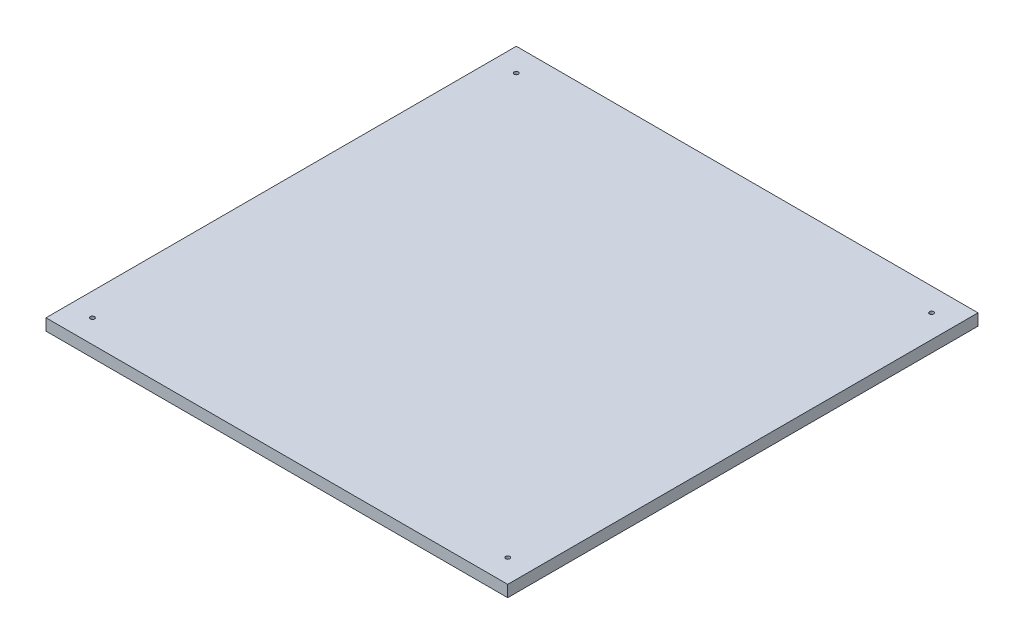
ISO-10303-21;
HEADER;
FILE_DESCRIPTION(('STEP AP214'),'2;1');
FILE_NAME('part.step','',(''),(''),'','','');
FILE_SCHEMA(('AUTOMOTIVE_DESIGN { 1 0 10303 214 1 1 1 1 }'));
ENDSEC;
DATA;
#1=APPLICATION_CONTEXT('core data for automotive mechanical design processes');
#2=APPLICATION_PROTOCOL_DEFINITION('international standard','automotive_design',2000,#1);
#3=PRODUCT_CONTEXT('',#1,'mechanical');
#4=PRODUCT('Part','Part','',(#3));
#5=PRODUCT_RELATED_PRODUCT_CATEGORY('part','',(#4));
#6=PRODUCT_DEFINITION_FORMATION('','',#4);
#7=PRODUCT_DEFINITION_CONTEXT('part definition',#1,'design');
#8=PRODUCT_DEFINITION('design','',#6,#7);
#9=PRODUCT_DEFINITION_SHAPE('','',#8);
#10=(LENGTH_UNIT() NAMED_UNIT(*) SI_UNIT(.MILLI.,.METRE.));
#11=(NAMED_UNIT(*) PLANE_ANGLE_UNIT() SI_UNIT($,.RADIAN.));
#12=(NAMED_UNIT(*) SI_UNIT($,.STERADIAN.) SOLID_ANGLE_UNIT());
#13=UNCERTAINTY_MEASURE_WITH_UNIT(LENGTH_MEASURE(1.E-05),#10,'distance_accuracy_value','');
#14=(GEOMETRIC_REPRESENTATION_CONTEXT(3) GLOBAL_UNCERTAINTY_ASSIGNED_CONTEXT((#13)) GLOBAL_UNIT_ASSIGNED_CONTEXT((#10,
#11,#12)) REPRESENTATION_CONTEXT('',''));
#15=CARTESIAN_POINT('',(0.,0.,0.));
#16=DIRECTION('',(0.,0.,1.));
#17=DIRECTION('',(1.,0.,0.));
#18=AXIS2_PLACEMENT_3D('',#15,#16,#17);
#19=CARTESIAN_POINT('',(298.45,15.,304.00625));
#20=DIRECTION('',(-1.,0.,0.));
#21=DIRECTION('',(0.,0.,1.));
#22=AXIS2_PLACEMENT_3D('',#19,#20,#21);
#23=PLANE('',#22);
#24=DIRECTION('',(0.,0.,-1.));
#25=VECTOR('',#24,1.);
#26=CARTESIAN_POINT('',(298.45,0.,304.00625));
#27=LINE('',#26,#25);
#28=CARTESIAN_POINT('',(298.45,0.,304.00625));
#29=VERTEX_POINT('',#28);
#30=CARTESIAN_POINT('',(298.45,0.,-304.00625));
#31=VERTEX_POINT('',#30);
#32=EDGE_CURVE('E95',#29,#31,#27,.T.);
#33=ORIENTED_EDGE('',*,*,#32,.T.);
#34=DIRECTION('',(0.,-1.,0.));
#35=VECTOR('',#34,1.);
#36=CARTESIAN_POINT('',(298.45,15.,-304.00625));
#37=LINE('',#36,#35);
#38=CARTESIAN_POINT('',(298.45,15.,-304.00625));
#39=VERTEX_POINT('',#38);
#40=EDGE_CURVE('E11',#39,#31,#37,.T.);
#41=ORIENTED_EDGE('',*,*,#40,.F.);
#42=DIRECTION('',(0.,0.,-1.));
#43=VECTOR('',#42,1.);
#44=CARTESIAN_POINT('',(298.45,15.,304.00625));
#45=LINE('',#44,#43);
#46=CARTESIAN_POINT('',(298.45,15.,304.00625));
#47=VERTEX_POINT('',#46);
#48=EDGE_CURVE('E83',#47,#39,#45,.T.);
#49=ORIENTED_EDGE('',*,*,#48,.F.);
#50=DIRECTION('',(0.,-1.,0.));
#51=VECTOR('',#50,1.);
#52=CARTESIAN_POINT('',(298.45,15.,304.00625));
#53=LINE('',#52,#51);
#54=EDGE_CURVE('E91',#47,#29,#53,.T.);
#55=ORIENTED_EDGE('',*,*,#54,.T.);
#56=EDGE_LOOP('',(#33,#41,#49,#55));
#57=FACE_BOUND('',#56,.T.);
#58=ADVANCED_FACE('F32',(#57),#23,.F.);
#59=CARTESIAN_POINT('',(-298.45,15.,-304.00625));
#60=DIRECTION('',(0.,0.,1.));
#61=DIRECTION('',(1.,0.,0.));
#62=AXIS2_PLACEMENT_3D('',#59,#60,#61);
#63=PLANE('',#62);
#64=DIRECTION('',(-1.,0.,0.));
#65=VECTOR('',#64,1.);
#66=CARTESIAN_POINT('',(-298.45,0.,-304.00625));
#67=LINE('',#66,#65);
#68=CARTESIAN_POINT('',(-298.45,0.,-304.00625));
#69=VERTEX_POINT('',#68);
#70=EDGE_CURVE('E87',#31,#69,#67,.T.);
#71=ORIENTED_EDGE('',*,*,#70,.T.);
#72=DIRECTION('',(0.,-1.,0.));
#73=VECTOR('',#72,1.);
#74=CARTESIAN_POINT('',(-298.45,15.,-304.00625));
#75=LINE('',#74,#73);
#76=CARTESIAN_POINT('',(-298.45,15.,-304.00625));
#77=VERTEX_POINT('',#76);
#78=EDGE_CURVE('E40',#77,#69,#75,.T.);
#79=ORIENTED_EDGE('',*,*,#78,.F.);
#80=DIRECTION('',(-1.,0.,0.));
#81=VECTOR('',#80,1.);
#82=CARTESIAN_POINT('',(-298.45,15.,-304.00625));
#83=LINE('',#82,#81);
#84=EDGE_CURVE('E78',#39,#77,#83,.T.);
#85=ORIENTED_EDGE('',*,*,#84,.F.);
#86=ORIENTED_EDGE('',*,*,#40,.T.);
#87=EDGE_LOOP('',(#71,#79,#85,#86));
#88=FACE_BOUND('',#87,.T.);
#89=ADVANCED_FACE('F86',(#88),#63,.F.);
#90=CARTESIAN_POINT('',(-298.45,15.,304.00625));
#91=DIRECTION('',(1.,0.,0.));
#92=DIRECTION('',(0.,0.,-1.));
#93=AXIS2_PLACEMENT_3D('',#90,#91,#92);
#94=PLANE('',#93);
#95=DIRECTION('',(0.,0.,1.));
#96=VECTOR('',#95,1.);
#97=CARTESIAN_POINT('',(-298.45,0.,304.00625));
#98=LINE('',#97,#96);
#99=CARTESIAN_POINT('',(-298.45,0.,304.00625));
#100=VERTEX_POINT('',#99);
#101=EDGE_CURVE('E65',#69,#100,#98,.T.);
#102=ORIENTED_EDGE('',*,*,#101,.T.);
#103=DIRECTION('',(0.,-1.,0.));
#104=VECTOR('',#103,1.);
#105=CARTESIAN_POINT('',(-298.45,15.,304.00625));
#106=LINE('',#105,#104);
#107=CARTESIAN_POINT('',(-298.45,15.,304.00625));
#108=VERTEX_POINT('',#107);
#109=EDGE_CURVE('E88',#108,#100,#106,.T.);
#110=ORIENTED_EDGE('',*,*,#109,.F.);
#111=DIRECTION('',(0.,0.,1.));
#112=VECTOR('',#111,1.);
#113=CARTESIAN_POINT('',(-298.45,15.,304.00625));
#114=LINE('',#113,#112);
#115=EDGE_CURVE('E81',#77,#108,#114,.T.);
#116=ORIENTED_EDGE('',*,*,#115,.F.);
#117=ORIENTED_EDGE('',*,*,#78,.T.);
#118=EDGE_LOOP('',(#102,#110,#116,#117));
#119=FACE_BOUND('',#118,.T.);
#120=ADVANCED_FACE('F89',(#119),#94,.F.);
#121=CARTESIAN_POINT('',(-298.45,15.,304.00625));
#122=DIRECTION('',(0.,0.,-1.));
#123=DIRECTION('',(-1.,0.,0.));
#124=AXIS2_PLACEMENT_3D('',#121,#122,#123);
#125=PLANE('',#124);
#126=DIRECTION('',(1.,0.,0.));
#127=VECTOR('',#126,1.);
#128=CARTESIAN_POINT('',(-298.45,0.,304.00625));
#129=LINE('',#128,#127);
#130=EDGE_CURVE('E71',#100,#29,#129,.T.);
#131=ORIENTED_EDGE('',*,*,#130,.T.);
#132=ORIENTED_EDGE('',*,*,#54,.F.);
#133=DIRECTION('',(1.,0.,0.));
#134=VECTOR('',#133,1.);
#135=CARTESIAN_POINT('',(-298.45,15.,304.00625));
#136=LINE('',#135,#134);
#137=EDGE_CURVE('E48',#108,#47,#136,.T.);
#138=ORIENTED_EDGE('',*,*,#137,.F.);
#139=ORIENTED_EDGE('',*,*,#109,.T.);
#140=EDGE_LOOP('',(#131,#132,#138,#139));
#141=FACE_BOUND('',#140,.T.);
#142=ADVANCED_FACE('F103',(#141),#125,.F.);
#143=CARTESIAN_POINT('',(0.,15.,0.));
#144=DIRECTION('',(0.,-1.,0.));
#145=DIRECTION('',(0.,0.,-1.));
#146=AXIS2_PLACEMENT_3D('',#143,#144,#145);
#147=PLANE('',#146);
#148=CARTESIAN_POINT('',(-268.45,15.,274.00625));
#149=DIRECTION('',(0.,1.,0.));
#150=DIRECTION('',(0.,0.,1.));
#151=AXIS2_PLACEMENT_3D('',#148,#149,#150);
#152=CIRCLE('',#151,2.70510000000002);
#153=CARTESIAN_POINT('',(-268.45,15.,276.71135));
#154=VERTEX_POINT('',#153);
#155=EDGE_CURVE('E129',#154,#154,#152,.T.);
#156=ORIENTED_EDGE('',*,*,#155,.F.);
#157=EDGE_LOOP('',(#156));
#158=FACE_BOUND('',#157,.T.);
#159=CARTESIAN_POINT('',(-268.45,15.,-274.00625));
#160=DIRECTION('',(0.,1.,0.));
#161=DIRECTION('',(0.,0.,1.));
#162=AXIS2_PLACEMENT_3D('',#159,#160,#161);
#163=CIRCLE('',#162,2.70510000000002);
#164=CARTESIAN_POINT('',(-268.45,15.,-271.30115));
#165=VERTEX_POINT('',#164);
#166=EDGE_CURVE('E123',#165,#165,#163,.T.);
#167=ORIENTED_EDGE('',*,*,#166,.F.);
#168=EDGE_LOOP('',(#167));
#169=FACE_BOUND('',#168,.T.);
#170=CARTESIAN_POINT('',(268.45,15.,-274.00625));
#171=DIRECTION('',(0.,1.,0.));
#172=DIRECTION('',(0.,0.,1.));
#173=AXIS2_PLACEMENT_3D('',#170,#171,#172);
#174=CIRCLE('',#173,2.70510000000002);
#175=CARTESIAN_POINT('',(268.45,15.,-271.30115));
#176=VERTEX_POINT('',#175);
#177=EDGE_CURVE('E117',#176,#176,#174,.T.);
#178=ORIENTED_EDGE('',*,*,#177,.F.);
#179=EDGE_LOOP('',(#178));
#180=FACE_BOUND('',#179,.T.);
#181=CARTESIAN_POINT('',(268.45,15.,274.00625));
#182=DIRECTION('',(0.,1.,0.));
#183=DIRECTION('',(0.,0.,1.));
#184=AXIS2_PLACEMENT_3D('',#181,#182,#183);
#185=CIRCLE('',#184,2.70510000000002);
#186=CARTESIAN_POINT('',(268.45,15.,276.71135));
#187=VERTEX_POINT('',#186);
#188=EDGE_CURVE('E111',#187,#187,#185,.T.);
#189=ORIENTED_EDGE('',*,*,#188,.F.);
#190=EDGE_LOOP('',(#189));
#191=FACE_BOUND('',#190,.T.);
#192=ORIENTED_EDGE('',*,*,#48,.T.);
#193=ORIENTED_EDGE('',*,*,#84,.T.);
#194=ORIENTED_EDGE('',*,*,#115,.T.);
#195=ORIENTED_EDGE('',*,*,#137,.T.);
#196=EDGE_LOOP('',(#192,#193,#194,#195));
#197=FACE_BOUND('',#196,.T.);
#198=ADVANCED_FACE('F79',(#158,#169,#180,#191,#197),#147,.F.);
#199=CARTESIAN_POINT('',(0.,0.,0.));
#200=DIRECTION('',(0.,-1.,0.));
#201=DIRECTION('',(0.,0.,-1.));
#202=AXIS2_PLACEMENT_3D('',#199,#200,#201);
#203=PLANE('',#202);
#204=CARTESIAN_POINT('',(-268.45,0.,274.00625));
#205=DIRECTION('',(0.,1.,0.));
#206=DIRECTION('',(0.,0.,1.));
#207=AXIS2_PLACEMENT_3D('',#204,#205,#206);
#208=CIRCLE('',#207,2.70510000000002);
#209=CARTESIAN_POINT('',(-268.45,0.,276.71135));
#210=VERTEX_POINT('',#209);
#211=EDGE_CURVE('E126',#210,#210,#208,.T.);
#212=ORIENTED_EDGE('',*,*,#211,.T.);
#213=EDGE_LOOP('',(#212));
#214=FACE_BOUND('',#213,.T.);
#215=CARTESIAN_POINT('',(-268.45,0.,-274.00625));
#216=DIRECTION('',(0.,1.,0.));
#217=DIRECTION('',(0.,0.,1.));
#218=AXIS2_PLACEMENT_3D('',#215,#216,#217);
#219=CIRCLE('',#218,2.70510000000002);
#220=CARTESIAN_POINT('',(-268.45,0.,-271.30115));
#221=VERTEX_POINT('',#220);
#222=EDGE_CURVE('E120',#221,#221,#219,.T.);
#223=ORIENTED_EDGE('',*,*,#222,.T.);
#224=EDGE_LOOP('',(#223));
#225=FACE_BOUND('',#224,.T.);
#226=CARTESIAN_POINT('',(268.45,0.,-274.00625));
#227=DIRECTION('',(0.,1.,0.));
#228=DIRECTION('',(0.,0.,1.));
#229=AXIS2_PLACEMENT_3D('',#226,#227,#228);
#230=CIRCLE('',#229,2.70510000000002);
#231=CARTESIAN_POINT('',(268.45,0.,-271.30115));
#232=VERTEX_POINT('',#231);
#233=EDGE_CURVE('E114',#232,#232,#230,.T.);
#234=ORIENTED_EDGE('',*,*,#233,.T.);
#235=EDGE_LOOP('',(#234));
#236=FACE_BOUND('',#235,.T.);
#237=CARTESIAN_POINT('',(268.45,0.,274.00625));
#238=DIRECTION('',(0.,1.,0.));
#239=DIRECTION('',(0.,0.,1.));
#240=AXIS2_PLACEMENT_3D('',#237,#238,#239);
#241=CIRCLE('',#240,2.70510000000002);
#242=CARTESIAN_POINT('',(268.45,0.,276.71135));
#243=VERTEX_POINT('',#242);
#244=EDGE_CURVE('E98',#243,#243,#241,.T.);
#245=ORIENTED_EDGE('',*,*,#244,.T.);
#246=EDGE_LOOP('',(#245));
#247=FACE_BOUND('',#246,.T.);
#248=ORIENTED_EDGE('',*,*,#32,.F.);
#249=ORIENTED_EDGE('',*,*,#130,.F.);
#250=ORIENTED_EDGE('',*,*,#101,.F.);
#251=ORIENTED_EDGE('',*,*,#70,.F.);
#252=EDGE_LOOP('',(#248,#249,#250,#251));
#253=FACE_BOUND('',#252,.T.);
#254=ADVANCED_FACE('F106',(#214,#225,#236,#247,#253),#203,.T.);
#255=CARTESIAN_POINT('',(268.45,15.,274.00625));
#256=DIRECTION('',(0.,1.,0.));
#257=DIRECTION('',(0.,0.,1.));
#258=AXIS2_PLACEMENT_3D('',#255,#256,#257);
#259=CYLINDRICAL_SURFACE('',#258,2.70510000000002);
#260=ORIENTED_EDGE('',*,*,#244,.F.);
#261=EDGE_LOOP('',(#260));
#262=FACE_BOUND('',#261,.T.);
#263=ORIENTED_EDGE('',*,*,#188,.T.);
#264=EDGE_LOOP('',(#263));
#265=FACE_BOUND('',#264,.T.);
#266=ADVANCED_FACE('F144',(#262,#265),#259,.F.);
#267=CARTESIAN_POINT('',(268.45,15.,-274.00625));
#268=DIRECTION('',(0.,1.,0.));
#269=DIRECTION('',(0.,0.,1.));
#270=AXIS2_PLACEMENT_3D('',#267,#268,#269);
#271=CYLINDRICAL_SURFACE('',#270,2.70510000000002);
#272=ORIENTED_EDGE('',*,*,#233,.F.);
#273=EDGE_LOOP('',(#272));
#274=FACE_BOUND('',#273,.T.);
#275=ORIENTED_EDGE('',*,*,#177,.T.);
#276=EDGE_LOOP('',(#275));
#277=FACE_BOUND('',#276,.T.);
#278=ADVANCED_FACE('F146',(#274,#277),#271,.F.);
#279=CARTESIAN_POINT('',(-268.45,15.,-274.00625));
#280=DIRECTION('',(0.,1.,0.));
#281=DIRECTION('',(0.,0.,1.));
#282=AXIS2_PLACEMENT_3D('',#279,#280,#281);
#283=CYLINDRICAL_SURFACE('',#282,2.70510000000002);
#284=ORIENTED_EDGE('',*,*,#222,.F.);
#285=EDGE_LOOP('',(#284));
#286=FACE_BOUND('',#285,.T.);
#287=ORIENTED_EDGE('',*,*,#166,.T.);
#288=EDGE_LOOP('',(#287));
#289=FACE_BOUND('',#288,.T.);
#290=ADVANCED_FACE('F153',(#286,#289),#283,.F.);
#291=CARTESIAN_POINT('',(-268.45,15.,274.00625));
#292=DIRECTION('',(0.,1.,0.));
#293=DIRECTION('',(0.,0.,1.));
#294=AXIS2_PLACEMENT_3D('',#291,#292,#293);
#295=CYLINDRICAL_SURFACE('',#294,2.70510000000002);
#296=ORIENTED_EDGE('',*,*,#211,.F.);
#297=EDGE_LOOP('',(#296));
#298=FACE_BOUND('',#297,.T.);
#299=ORIENTED_EDGE('',*,*,#155,.T.);
#300=EDGE_LOOP('',(#299));
#301=FACE_BOUND('',#300,.T.);
#302=ADVANCED_FACE('F133',(#298,#301),#295,.F.);
#303=CLOSED_SHELL('',(#58,#89,#120,#142,#198,#254,#266,#278,#290,#302));
#304=MANIFOLD_SOLID_BREP('B2',#303);
#305=ADVANCED_BREP_SHAPE_REPRESENTATION('',(#18,#304),#14);
#306=SHAPE_DEFINITION_REPRESENTATION(#9,#305);
ENDSEC;
END-ISO-10303-21;
